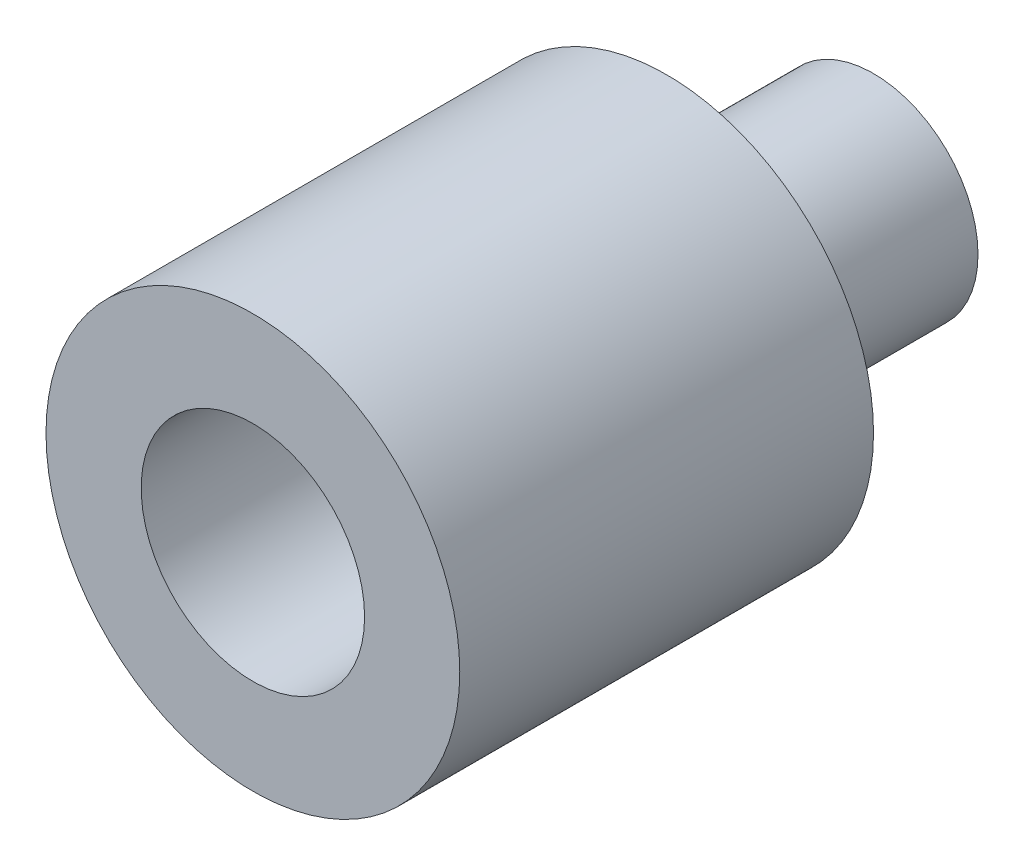
ISO-10303-21;
HEADER;
FILE_DESCRIPTION(('STEP AP214'),'2;1');
FILE_NAME('part.step','',(''),(''),'','','');
FILE_SCHEMA(('AUTOMOTIVE_DESIGN { 1 0 10303 214 1 1 1 1 }'));
ENDSEC;
DATA;
#1=APPLICATION_CONTEXT('core data for automotive mechanical design processes');
#2=APPLICATION_PROTOCOL_DEFINITION('international standard','automotive_design',2000,#1);
#3=PRODUCT_CONTEXT('',#1,'mechanical');
#4=PRODUCT('Part','Part','',(#3));
#5=PRODUCT_RELATED_PRODUCT_CATEGORY('part','',(#4));
#6=PRODUCT_DEFINITION_FORMATION('','',#4);
#7=PRODUCT_DEFINITION_CONTEXT('part definition',#1,'design');
#8=PRODUCT_DEFINITION('design','',#6,#7);
#9=PRODUCT_DEFINITION_SHAPE('','',#8);
#10=(LENGTH_UNIT() NAMED_UNIT(*) SI_UNIT(.MILLI.,.METRE.));
#11=(NAMED_UNIT(*) PLANE_ANGLE_UNIT() SI_UNIT($,.RADIAN.));
#12=(NAMED_UNIT(*) SI_UNIT($,.STERADIAN.) SOLID_ANGLE_UNIT());
#13=UNCERTAINTY_MEASURE_WITH_UNIT(LENGTH_MEASURE(1.E-05),#10,'distance_accuracy_value','');
#14=(GEOMETRIC_REPRESENTATION_CONTEXT(3) GLOBAL_UNCERTAINTY_ASSIGNED_CONTEXT((#13)) GLOBAL_UNIT_ASSIGNED_CONTEXT((#10,
#11,#12)) REPRESENTATION_CONTEXT('',''));
#15=CARTESIAN_POINT('',(0.,0.,0.));
#16=DIRECTION('',(0.,0.,1.));
#17=DIRECTION('',(1.,0.,0.));
#18=AXIS2_PLACEMENT_3D('',#15,#16,#17);
#19=CARTESIAN_POINT('',(0.,0.,5.));
#20=DIRECTION('',(0.,0.,-1.));
#21=DIRECTION('',(-1.,0.,0.));
#22=AXIS2_PLACEMENT_3D('',#19,#20,#21);
#23=CYLINDRICAL_SURFACE('',#22,2.525);
#24=CARTESIAN_POINT('',(0.,0.,5.));
#25=DIRECTION('',(0.,0.,1.));
#26=DIRECTION('',(1.,0.,0.));
#27=AXIS2_PLACEMENT_3D('',#24,#25,#26);
#28=CIRCLE('',#27,2.525);
#29=CARTESIAN_POINT('',(2.525,0.,5.));
#30=VERTEX_POINT('',#29);
#31=EDGE_CURVE('E10',#30,#30,#28,.T.);
#32=ORIENTED_EDGE('',*,*,#31,.F.);
#33=EDGE_LOOP('',(#32));
#34=FACE_BOUND('',#33,.T.);
#35=CARTESIAN_POINT('',(0.,0.,0.));
#36=DIRECTION('',(0.,0.,1.));
#37=DIRECTION('',(1.,0.,0.));
#38=AXIS2_PLACEMENT_3D('',#35,#36,#37);
#39=CIRCLE('',#38,2.525);
#40=CARTESIAN_POINT('',(2.525,0.,0.));
#41=VERTEX_POINT('',#40);
#42=EDGE_CURVE('E42',#41,#41,#39,.T.);
#43=ORIENTED_EDGE('',*,*,#42,.T.);
#44=EDGE_LOOP('',(#43));
#45=FACE_BOUND('',#44,.T.);
#46=ADVANCED_FACE('F39',(#34,#45),#23,.T.);
#47=CARTESIAN_POINT('',(0.,0.,0.));
#48=DIRECTION('',(0.,0.,1.));
#49=DIRECTION('',(1.,0.,0.));
#50=AXIS2_PLACEMENT_3D('',#47,#48,#49);
#51=PLANE('',#50);
#52=ORIENTED_EDGE('',*,*,#42,.F.);
#53=EDGE_LOOP('',(#52));
#54=FACE_BOUND('',#53,.T.);
#55=ADVANCED_FACE('F81',(#54),#51,.F.);
#56=CARTESIAN_POINT('',(0.,0.,15.));
#57=DIRECTION('',(0.,0.,-1.));
#58=DIRECTION('',(-1.,0.,0.));
#59=AXIS2_PLACEMENT_3D('',#56,#57,#58);
#60=CYLINDRICAL_SURFACE('',#59,5.);
#61=CARTESIAN_POINT('',(0.,0.,15.));
#62=DIRECTION('',(0.,0.,1.));
#63=DIRECTION('',(1.,0.,0.));
#64=AXIS2_PLACEMENT_3D('',#61,#62,#63);
#65=CIRCLE('',#64,5.);
#66=CARTESIAN_POINT('',(5.,0.,15.));
#67=VERTEX_POINT('',#66);
#68=EDGE_CURVE('E49',#67,#67,#65,.T.);
#69=ORIENTED_EDGE('',*,*,#68,.F.);
#70=EDGE_LOOP('',(#69));
#71=FACE_BOUND('',#70,.T.);
#72=CARTESIAN_POINT('',(0.,0.,5.));
#73=DIRECTION('',(0.,0.,1.));
#74=DIRECTION('',(1.,0.,0.));
#75=AXIS2_PLACEMENT_3D('',#72,#73,#74);
#76=CIRCLE('',#75,5.);
#77=CARTESIAN_POINT('',(5.,0.,5.));
#78=VERTEX_POINT('',#77);
#79=EDGE_CURVE('E51',#78,#78,#76,.T.);
#80=ORIENTED_EDGE('',*,*,#79,.T.);
#81=EDGE_LOOP('',(#80));
#82=FACE_BOUND('',#81,.T.);
#83=ADVANCED_FACE('F75',(#71,#82),#60,.T.);
#84=CARTESIAN_POINT('',(0.,0.,15.));
#85=DIRECTION('',(0.,0.,1.));
#86=DIRECTION('',(1.,0.,0.));
#87=AXIS2_PLACEMENT_3D('',#84,#85,#86);
#88=PLANE('',#87);
#89=CARTESIAN_POINT('',(0.,0.,15.));
#90=DIRECTION('',(0.,0.,1.));
#91=DIRECTION('',(1.,0.,0.));
#92=AXIS2_PLACEMENT_3D('',#89,#90,#91);
#93=CIRCLE('',#92,2.7);
#94=CARTESIAN_POINT('',(2.7,0.,15.));
#95=VERTEX_POINT('',#94);
#96=EDGE_CURVE('E57',#95,#95,#93,.T.);
#97=ORIENTED_EDGE('',*,*,#96,.F.);
#98=EDGE_LOOP('',(#97));
#99=FACE_BOUND('',#98,.T.);
#100=ORIENTED_EDGE('',*,*,#68,.T.);
#101=EDGE_LOOP('',(#100));
#102=FACE_BOUND('',#101,.T.);
#103=ADVANCED_FACE('F72',(#99,#102),#88,.T.);
#104=CARTESIAN_POINT('',(0.,0.,5.));
#105=DIRECTION('',(0.,0.,1.));
#106=DIRECTION('',(1.,0.,0.));
#107=AXIS2_PLACEMENT_3D('',#104,#105,#106);
#108=PLANE('',#107);
#109=ORIENTED_EDGE('',*,*,#31,.T.);
#110=EDGE_LOOP('',(#109));
#111=FACE_BOUND('',#110,.T.);
#112=ORIENTED_EDGE('',*,*,#79,.F.);
#113=EDGE_LOOP('',(#112));
#114=FACE_BOUND('',#113,.T.);
#115=ADVANCED_FACE('F68',(#111,#114),#108,.F.);
#116=CARTESIAN_POINT('',(0.,0.,7.));
#117=DIRECTION('',(0.,0.,1.));
#118=DIRECTION('',(1.,0.,0.));
#119=AXIS2_PLACEMENT_3D('',#116,#117,#118);
#120=CYLINDRICAL_SURFACE('',#119,2.7);
#121=CARTESIAN_POINT('',(0.,0.,7.));
#122=DIRECTION('',(0.,0.,1.));
#123=DIRECTION('',(1.,0.,0.));
#124=AXIS2_PLACEMENT_3D('',#121,#122,#123);
#125=CIRCLE('',#124,2.7);
#126=CARTESIAN_POINT('',(2.7,0.,7.));
#127=VERTEX_POINT('',#126);
#128=EDGE_CURVE('E54',#127,#127,#125,.T.);
#129=ORIENTED_EDGE('',*,*,#128,.F.);
#130=EDGE_LOOP('',(#129));
#131=FACE_BOUND('',#130,.T.);
#132=ORIENTED_EDGE('',*,*,#96,.T.);
#133=EDGE_LOOP('',(#132));
#134=FACE_BOUND('',#133,.T.);
#135=ADVANCED_FACE('F65',(#131,#134),#120,.F.);
#136=CARTESIAN_POINT('',(0.,0.,7.));
#137=DIRECTION('',(0.,0.,1.));
#138=DIRECTION('',(1.,0.,0.));
#139=AXIS2_PLACEMENT_3D('',#136,#137,#138);
#140=PLANE('',#139);
#141=ORIENTED_EDGE('',*,*,#128,.T.);
#142=EDGE_LOOP('',(#141));
#143=FACE_BOUND('',#142,.T.);
#144=ADVANCED_FACE('F63',(#143),#140,.T.);
#145=CLOSED_SHELL('',(#46,#55,#83,#103,#115,#135,#144));
#146=MANIFOLD_SOLID_BREP('B2',#145);
#147=ADVANCED_BREP_SHAPE_REPRESENTATION('',(#18,#146),#14);
#148=SHAPE_DEFINITION_REPRESENTATION(#9,#147);
ENDSEC;
END-ISO-10303-21;
